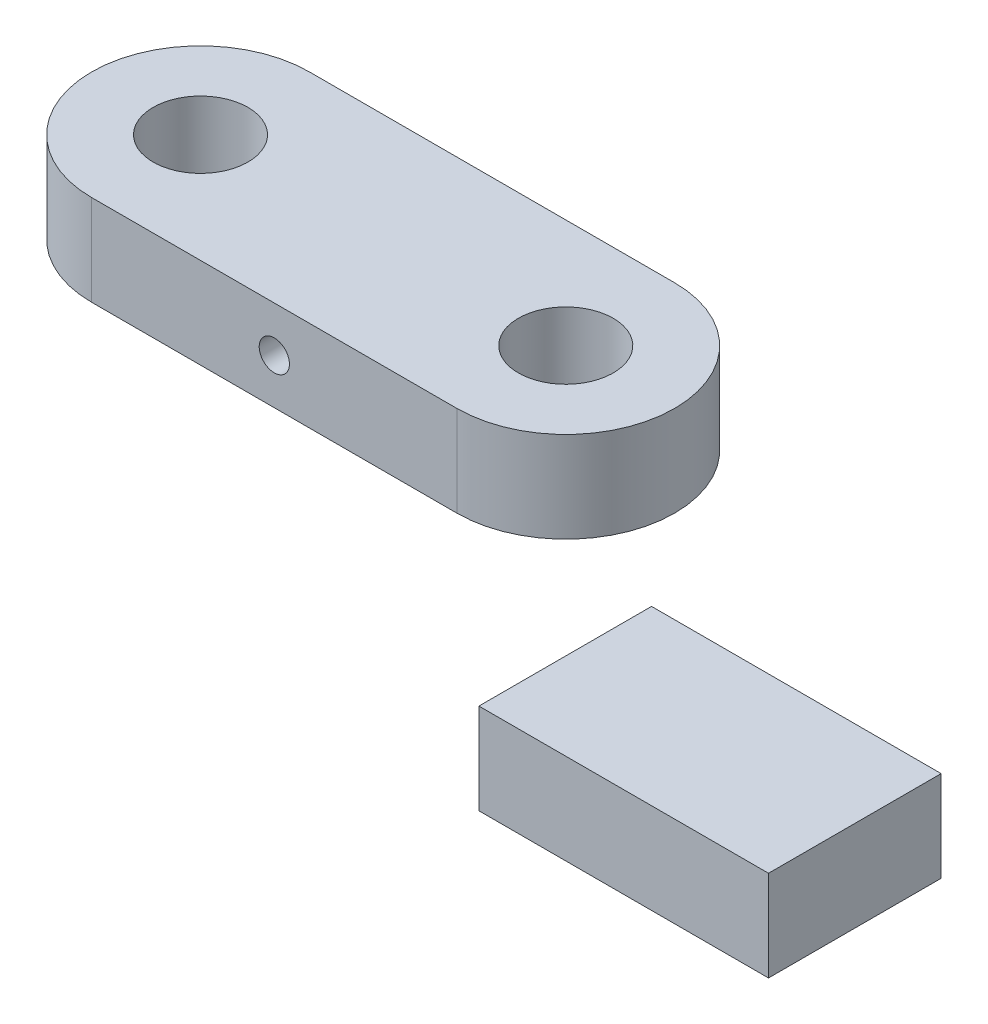
ISO-10303-21;
HEADER;
FILE_DESCRIPTION(('STEP AP214'),'2;1');
FILE_NAME('part.step','',(''),(''),'','','');
FILE_SCHEMA(('AUTOMOTIVE_DESIGN { 1 0 10303 214 1 1 1 1 }'));
ENDSEC;
DATA;
#1=APPLICATION_CONTEXT('core data for automotive mechanical design processes');
#2=APPLICATION_PROTOCOL_DEFINITION('international standard','automotive_design',2000,#1);
#3=PRODUCT_CONTEXT('',#1,'mechanical');
#4=PRODUCT('Part','Part','',(#3));
#5=PRODUCT_RELATED_PRODUCT_CATEGORY('part','',(#4));
#6=PRODUCT_DEFINITION_FORMATION('','',#4);
#7=PRODUCT_DEFINITION_CONTEXT('part definition',#1,'design');
#8=PRODUCT_DEFINITION('design','',#6,#7);
#9=PRODUCT_DEFINITION_SHAPE('','',#8);
#10=(LENGTH_UNIT() NAMED_UNIT(*) SI_UNIT(.MILLI.,.METRE.));
#11=(NAMED_UNIT(*) PLANE_ANGLE_UNIT() SI_UNIT($,.RADIAN.));
#12=(NAMED_UNIT(*) SI_UNIT($,.STERADIAN.) SOLID_ANGLE_UNIT());
#13=UNCERTAINTY_MEASURE_WITH_UNIT(LENGTH_MEASURE(1.E-05),#10,'distance_accuracy_value','');
#14=(GEOMETRIC_REPRESENTATION_CONTEXT(3) GLOBAL_UNCERTAINTY_ASSIGNED_CONTEXT((#13)) GLOBAL_UNIT_ASSIGNED_CONTEXT((#10,
#11,#12)) REPRESENTATION_CONTEXT('',''));
#15=CARTESIAN_POINT('',(0.,0.,0.));
#16=DIRECTION('',(0.,0.,1.));
#17=DIRECTION('',(1.,0.,0.));
#18=AXIS2_PLACEMENT_3D('',#15,#16,#17);
#19=CARTESIAN_POINT('',(0.,4.7625,0.));
#20=DIRECTION('',(0.,1.,0.));
#21=DIRECTION('',(0.,0.,1.));
#22=AXIS2_PLACEMENT_3D('',#19,#20,#21);
#23=PLANE('',#22);
#24=DIRECTION('',(0.,0.,-1.));
#25=VECTOR('',#24,1.);
#26=CARTESIAN_POINT('',(33.2853368756938,4.7625,18.6695257850644));
#27=LINE('',#26,#25);
#28=CARTESIAN_POINT('',(33.2853368756938,4.7625,18.6695257850644));
#29=VERTEX_POINT('',#28);
#30=CARTESIAN_POINT('',(33.2853368756938,4.7625,9.60613363255192));
#31=VERTEX_POINT('',#30);
#32=EDGE_CURVE('E53',#29,#31,#27,.T.);
#33=ORIENTED_EDGE('',*,*,#32,.F.);
#34=DIRECTION('',(-1.,0.,0.));
#35=VECTOR('',#34,1.);
#36=CARTESIAN_POINT('',(33.2853368756938,4.7625,18.6695257850644));
#37=LINE('',#36,#35);
#38=CARTESIAN_POINT('',(48.4896190405113,4.7625,18.6695257850644));
#39=VERTEX_POINT('',#38);
#40=EDGE_CURVE('E76',#39,#29,#37,.T.);
#41=ORIENTED_EDGE('',*,*,#40,.F.);
#42=DIRECTION('',(0.,0.,1.));
#43=VECTOR('',#42,1.);
#44=CARTESIAN_POINT('',(48.4896190405113,4.7625,18.6695257850644));
#45=LINE('',#44,#43);
#46=CARTESIAN_POINT('',(48.4896190405113,4.76250000000001,9.60613363255192));
#47=VERTEX_POINT('',#46);
#48=EDGE_CURVE('E81',#47,#39,#45,.T.);
#49=ORIENTED_EDGE('',*,*,#48,.F.);
#50=DIRECTION('',(1.,0.,0.));
#51=VECTOR('',#50,1.);
#52=CARTESIAN_POINT('',(33.2853368756938,4.7625,9.60613363255192));
#53=LINE('',#52,#51);
#54=EDGE_CURVE('E96',#31,#47,#53,.T.);
#55=ORIENTED_EDGE('',*,*,#54,.F.);
#56=EDGE_LOOP('',(#33,#41,#49,#55));
#57=FACE_BOUND('',#56,.T.);
#58=ADVANCED_FACE('F45',(#57),#23,.T.);
#59=CARTESIAN_POINT('',(0.,0.,0.));
#60=DIRECTION('',(0.,-1.,0.));
#61=DIRECTION('',(0.,0.,-1.));
#62=AXIS2_PLACEMENT_3D('',#59,#60,#61);
#63=PLANE('',#62);
#64=DIRECTION('',(0.,0.,-1.));
#65=VECTOR('',#64,1.);
#66=CARTESIAN_POINT('',(33.2853368756938,0.,18.6695257850644));
#67=LINE('',#66,#65);
#68=CARTESIAN_POINT('',(33.2853368756938,0.,18.6695257850644));
#69=VERTEX_POINT('',#68);
#70=CARTESIAN_POINT('',(33.2853368756938,0.,9.60613363255192));
#71=VERTEX_POINT('',#70);
#72=EDGE_CURVE('E105',#69,#71,#67,.T.);
#73=ORIENTED_EDGE('',*,*,#72,.T.);
#74=DIRECTION('',(1.,0.,0.));
#75=VECTOR('',#74,1.);
#76=CARTESIAN_POINT('',(33.2853368756938,0.,9.60613363255192));
#77=LINE('',#76,#75);
#78=CARTESIAN_POINT('',(48.4896190405113,0.,9.60613363255192));
#79=VERTEX_POINT('',#78);
#80=EDGE_CURVE('E94',#71,#79,#77,.T.);
#81=ORIENTED_EDGE('',*,*,#80,.T.);
#82=DIRECTION('',(0.,0.,1.));
#83=VECTOR('',#82,1.);
#84=CARTESIAN_POINT('',(48.4896190405113,0.,18.6695257850644));
#85=LINE('',#84,#83);
#86=CARTESIAN_POINT('',(48.4896190405113,0.,18.6695257850644));
#87=VERTEX_POINT('',#86);
#88=EDGE_CURVE('E97',#79,#87,#85,.T.);
#89=ORIENTED_EDGE('',*,*,#88,.T.);
#90=DIRECTION('',(-1.,0.,0.));
#91=VECTOR('',#90,1.);
#92=CARTESIAN_POINT('',(33.2853368756938,0.,18.6695257850644));
#93=LINE('',#92,#91);
#94=EDGE_CURVE('E102',#87,#69,#93,.T.);
#95=ORIENTED_EDGE('',*,*,#94,.T.);
#96=EDGE_LOOP('',(#73,#81,#89,#95));
#97=FACE_BOUND('',#96,.T.);
#98=ADVANCED_FACE('F104',(#97),#63,.T.);
#99=CARTESIAN_POINT('',(33.2853368756938,22.4632139250826,9.60613363255192));
#100=DIRECTION('',(0.,0.,-1.));
#101=DIRECTION('',(-1.,0.,0.));
#102=AXIS2_PLACEMENT_3D('',#99,#100,#101);
#103=PLANE('',#102);
#104=DIRECTION('',(0.,-1.,0.));
#105=VECTOR('',#104,1.);
#106=CARTESIAN_POINT('',(33.2853368756938,22.4632139250826,9.60613363255192));
#107=LINE('',#106,#105);
#108=EDGE_CURVE('E12',#31,#71,#107,.T.);
#109=ORIENTED_EDGE('',*,*,#108,.F.);
#110=ORIENTED_EDGE('',*,*,#54,.T.);
#111=DIRECTION('',(0.,-1.,0.));
#112=VECTOR('',#111,1.);
#113=CARTESIAN_POINT('',(48.4896190405113,22.4632139250826,9.60613363255192));
#114=LINE('',#113,#112);
#115=EDGE_CURVE('E91',#47,#79,#114,.T.);
#116=ORIENTED_EDGE('',*,*,#115,.T.);
#117=ORIENTED_EDGE('',*,*,#80,.F.);
#118=EDGE_LOOP('',(#109,#110,#116,#117));
#119=FACE_BOUND('',#118,.T.);
#120=ADVANCED_FACE('F92',(#119),#103,.T.);
#121=CARTESIAN_POINT('',(48.4896190405113,22.4632139250826,18.6695257850644));
#122=DIRECTION('',(1.,0.,0.));
#123=DIRECTION('',(0.,0.,-1.));
#124=AXIS2_PLACEMENT_3D('',#121,#122,#123);
#125=PLANE('',#124);
#126=ORIENTED_EDGE('',*,*,#115,.F.);
#127=ORIENTED_EDGE('',*,*,#48,.T.);
#128=DIRECTION('',(0.,-1.,0.));
#129=VECTOR('',#128,1.);
#130=CARTESIAN_POINT('',(48.4896190405113,22.4632139250826,18.6695257850644));
#131=LINE('',#130,#129);
#132=EDGE_CURVE('E86',#39,#87,#131,.T.);
#133=ORIENTED_EDGE('',*,*,#132,.T.);
#134=ORIENTED_EDGE('',*,*,#88,.F.);
#135=EDGE_LOOP('',(#126,#127,#133,#134));
#136=FACE_BOUND('',#135,.T.);
#137=ADVANCED_FACE('F98',(#136),#125,.T.);
#138=CARTESIAN_POINT('',(33.2853368756938,22.4632139250826,18.6695257850644));
#139=DIRECTION('',(0.,0.,1.));
#140=DIRECTION('',(1.,0.,0.));
#141=AXIS2_PLACEMENT_3D('',#138,#139,#140);
#142=PLANE('',#141);
#143=ORIENTED_EDGE('',*,*,#132,.F.);
#144=ORIENTED_EDGE('',*,*,#40,.T.);
#145=DIRECTION('',(0.,-1.,0.));
#146=VECTOR('',#145,1.);
#147=CARTESIAN_POINT('',(33.2853368756938,22.4632139250826,18.6695257850644));
#148=LINE('',#147,#146);
#149=EDGE_CURVE('E112',#29,#69,#148,.T.);
#150=ORIENTED_EDGE('',*,*,#149,.T.);
#151=ORIENTED_EDGE('',*,*,#94,.F.);
#152=EDGE_LOOP('',(#143,#144,#150,#151));
#153=FACE_BOUND('',#152,.T.);
#154=ADVANCED_FACE('F118',(#153),#142,.T.);
#155=CARTESIAN_POINT('',(33.2853368756938,22.4632139250826,18.6695257850644));
#156=DIRECTION('',(-1.,0.,0.));
#157=DIRECTION('',(0.,0.,1.));
#158=AXIS2_PLACEMENT_3D('',#155,#156,#157);
#159=PLANE('',#158);
#160=ORIENTED_EDGE('',*,*,#149,.F.);
#161=ORIENTED_EDGE('',*,*,#32,.T.);
#162=ORIENTED_EDGE('',*,*,#108,.T.);
#163=ORIENTED_EDGE('',*,*,#72,.F.);
#164=EDGE_LOOP('',(#160,#161,#162,#163));
#165=FACE_BOUND('',#164,.T.);
#166=ADVANCED_FACE('F119',(#165),#159,.T.);
#167=CLOSED_SHELL('',(#58,#98,#120,#137,#154,#166));
#168=MANIFOLD_SOLID_BREP('B2',#167);
#169=CARTESIAN_POINT('',(0.,4.7625,0.));
#170=DIRECTION('',(0.,1.,0.));
#171=DIRECTION('',(0.,0.,1.));
#172=AXIS2_PLACEMENT_3D('',#169,#170,#171);
#173=PLANE('',#172);
#174=CARTESIAN_POINT('',(0.,4.7625,0.));
#175=DIRECTION('',(0.,1.,0.));
#176=DIRECTION('',(0.,0.,1.));
#177=AXIS2_PLACEMENT_3D('',#174,#175,#176);
#178=CIRCLE('',#177,2.4892);
#179=CARTESIAN_POINT('',(0.,4.7625,-2.4892));
#180=VERTEX_POINT('',#179);
#181=EDGE_CURVE('E235',#180,#180,#178,.T.);
#182=ORIENTED_EDGE('',*,*,#181,.F.);
#183=EDGE_LOOP('',(#182));
#184=FACE_BOUND('',#183,.T.);
#185=CARTESIAN_POINT('',(0.,4.7625,0.));
#186=DIRECTION('',(0.,1.,0.));
#187=DIRECTION('',(0.,0.,1.));
#188=AXIS2_PLACEMENT_3D('',#185,#186,#187);
#189=CIRCLE('',#188,5.715);
#190=CARTESIAN_POINT('',(0.,4.7625,-5.715));
#191=VERTEX_POINT('',#190);
#192=CARTESIAN_POINT('',(0.,4.7625,5.715));
#193=VERTEX_POINT('',#192);
#194=EDGE_CURVE('E220',#191,#193,#189,.T.);
#195=ORIENTED_EDGE('',*,*,#194,.T.);
#196=DIRECTION('',(1.,0.,0.));
#197=VECTOR('',#196,1.);
#198=CARTESIAN_POINT('',(0.,4.7625,5.715));
#199=LINE('',#198,#197);
#200=CARTESIAN_POINT('',(19.177,4.7625,5.715));
#201=VERTEX_POINT('',#200);
#202=EDGE_CURVE('E215',#193,#201,#199,.T.);
#203=ORIENTED_EDGE('',*,*,#202,.T.);
#204=CARTESIAN_POINT('',(19.177,4.7625,0.));
#205=DIRECTION('',(0.,1.,0.));
#206=DIRECTION('',(0.,0.,1.));
#207=AXIS2_PLACEMENT_3D('',#204,#205,#206);
#208=CIRCLE('',#207,5.715);
#209=CARTESIAN_POINT('',(19.177,4.7625,-5.715));
#210=VERTEX_POINT('',#209);
#211=EDGE_CURVE('E218',#201,#210,#208,.T.);
#212=ORIENTED_EDGE('',*,*,#211,.T.);
#213=DIRECTION('',(-1.,0.,0.));
#214=VECTOR('',#213,1.);
#215=CARTESIAN_POINT('',(0.,4.7625,-5.715));
#216=LINE('',#215,#214);
#217=EDGE_CURVE('E185',#210,#191,#216,.T.);
#218=ORIENTED_EDGE('',*,*,#217,.T.);
#219=EDGE_LOOP('',(#195,#203,#212,#218));
#220=FACE_BOUND('',#219,.T.);
#221=CARTESIAN_POINT('',(19.177,4.7625,0.));
#222=DIRECTION('',(0.,1.,0.));
#223=DIRECTION('',(0.,0.,1.));
#224=AXIS2_PLACEMENT_3D('',#221,#222,#223);
#225=CIRCLE('',#224,2.4892);
#226=CARTESIAN_POINT('',(19.177,4.7625,-2.4892));
#227=VERTEX_POINT('',#226);
#228=EDGE_CURVE('E250',#227,#227,#225,.T.);
#229=ORIENTED_EDGE('',*,*,#228,.F.);
#230=EDGE_LOOP('',(#229));
#231=FACE_BOUND('',#230,.T.);
#232=ADVANCED_FACE('F168',(#184,#220,#231),#173,.T.);
#233=CARTESIAN_POINT('',(0.,0.,0.));
#234=DIRECTION('',(0.,1.,0.));
#235=DIRECTION('',(0.,0.,1.));
#236=AXIS2_PLACEMENT_3D('',#233,#234,#235);
#237=PLANE('',#236);
#238=CARTESIAN_POINT('',(0.,0.,0.));
#239=DIRECTION('',(0.,1.,0.));
#240=DIRECTION('',(0.,0.,1.));
#241=AXIS2_PLACEMENT_3D('',#238,#239,#240);
#242=CIRCLE('',#241,5.715);
#243=CARTESIAN_POINT('',(0.,0.,-5.715));
#244=VERTEX_POINT('',#243);
#245=CARTESIAN_POINT('',(0.,0.,5.715));
#246=VERTEX_POINT('',#245);
#247=EDGE_CURVE('E232',#244,#246,#242,.T.);
#248=ORIENTED_EDGE('',*,*,#247,.F.);
#249=DIRECTION('',(-1.,0.,0.));
#250=VECTOR('',#249,1.);
#251=CARTESIAN_POINT('',(0.,0.,-5.715));
#252=LINE('',#251,#250);
#253=CARTESIAN_POINT('',(19.177,0.,-5.715));
#254=VERTEX_POINT('',#253);
#255=EDGE_CURVE('E208',#254,#244,#252,.T.);
#256=ORIENTED_EDGE('',*,*,#255,.F.);
#257=CARTESIAN_POINT('',(19.177,0.,0.));
#258=DIRECTION('',(0.,1.,0.));
#259=DIRECTION('',(0.,0.,1.));
#260=AXIS2_PLACEMENT_3D('',#257,#258,#259);
#261=CIRCLE('',#260,5.715);
#262=CARTESIAN_POINT('',(19.177,0.,5.715));
#263=VERTEX_POINT('',#262);
#264=EDGE_CURVE('E202',#263,#254,#261,.T.);
#265=ORIENTED_EDGE('',*,*,#264,.F.);
#266=DIRECTION('',(1.,0.,0.));
#267=VECTOR('',#266,1.);
#268=CARTESIAN_POINT('',(0.,0.,5.715));
#269=LINE('',#268,#267);
#270=EDGE_CURVE('E224',#246,#263,#269,.T.);
#271=ORIENTED_EDGE('',*,*,#270,.F.);
#272=EDGE_LOOP('',(#248,#256,#265,#271));
#273=FACE_BOUND('',#272,.T.);
#274=CARTESIAN_POINT('',(0.,0.,0.));
#275=DIRECTION('',(0.,1.,0.));
#276=DIRECTION('',(0.,0.,1.));
#277=AXIS2_PLACEMENT_3D('',#274,#275,#276);
#278=CIRCLE('',#277,2.4892);
#279=CARTESIAN_POINT('',(0.,0.,-2.4892));
#280=VERTEX_POINT('',#279);
#281=EDGE_CURVE('E247',#280,#280,#278,.T.);
#282=ORIENTED_EDGE('',*,*,#281,.T.);
#283=EDGE_LOOP('',(#282));
#284=FACE_BOUND('',#283,.T.);
#285=CARTESIAN_POINT('',(19.177,0.,0.));
#286=DIRECTION('',(0.,1.,0.));
#287=DIRECTION('',(0.,0.,1.));
#288=AXIS2_PLACEMENT_3D('',#285,#286,#287);
#289=CIRCLE('',#288,2.4892);
#290=CARTESIAN_POINT('',(19.177,0.,-2.4892));
#291=VERTEX_POINT('',#290);
#292=EDGE_CURVE('E253',#291,#291,#289,.T.);
#293=ORIENTED_EDGE('',*,*,#292,.T.);
#294=EDGE_LOOP('',(#293));
#295=FACE_BOUND('',#294,.T.);
#296=ADVANCED_FACE('F243',(#273,#284,#295),#237,.F.);
#297=CARTESIAN_POINT('',(0.,4.7625,0.));
#298=DIRECTION('',(0.,-1.,0.));
#299=DIRECTION('',(0.,0.,-1.));
#300=AXIS2_PLACEMENT_3D('',#297,#298,#299);
#301=CYLINDRICAL_SURFACE('',#300,5.715);
#302=ORIENTED_EDGE('',*,*,#247,.T.);
#303=DIRECTION('',(0.,-1.,0.));
#304=VECTOR('',#303,1.);
#305=CARTESIAN_POINT('',(0.,4.7625,5.715));
#306=LINE('',#305,#304);
#307=EDGE_CURVE('E43',#193,#246,#306,.T.);
#308=ORIENTED_EDGE('',*,*,#307,.F.);
#309=ORIENTED_EDGE('',*,*,#194,.F.);
#310=DIRECTION('',(0.,-1.,0.));
#311=VECTOR('',#310,1.);
#312=CARTESIAN_POINT('',(0.,4.7625,-5.715));
#313=LINE('',#312,#311);
#314=EDGE_CURVE('E228',#191,#244,#313,.T.);
#315=ORIENTED_EDGE('',*,*,#314,.T.);
#316=EDGE_LOOP('',(#302,#308,#309,#315));
#317=FACE_BOUND('',#316,.T.);
#318=ADVANCED_FACE('F170',(#317),#301,.T.);
#319=CARTESIAN_POINT('',(0.,4.7625,5.715));
#320=DIRECTION('',(0.,0.,-1.));
#321=DIRECTION('',(-1.,0.,0.));
#322=AXIS2_PLACEMENT_3D('',#319,#320,#321);
#323=PLANE('',#322);
#324=CARTESIAN_POINT('',(9.5885,2.38125,5.715));
#325=DIRECTION('',(0.,0.,-1.));
#326=DIRECTION('',(-1.,0.,0.));
#327=AXIS2_PLACEMENT_3D('',#324,#325,#326);
#328=CIRCLE('',#327,0.793749999999999);
#329=CARTESIAN_POINT('',(8.79475,2.38125,5.715));
#330=VERTEX_POINT('',#329);
#331=EDGE_CURVE('E256',#330,#330,#328,.T.);
#332=ORIENTED_EDGE('',*,*,#331,.T.);
#333=EDGE_LOOP('',(#332));
#334=FACE_BOUND('',#333,.T.);
#335=ORIENTED_EDGE('',*,*,#270,.T.);
#336=DIRECTION('',(0.,-1.,0.));
#337=VECTOR('',#336,1.);
#338=CARTESIAN_POINT('',(19.177,4.7625,5.715));
#339=LINE('',#338,#337);
#340=EDGE_CURVE('E177',#201,#263,#339,.T.);
#341=ORIENTED_EDGE('',*,*,#340,.F.);
#342=ORIENTED_EDGE('',*,*,#202,.F.);
#343=ORIENTED_EDGE('',*,*,#307,.T.);
#344=EDGE_LOOP('',(#335,#341,#342,#343));
#345=FACE_BOUND('',#344,.T.);
#346=ADVANCED_FACE('F223',(#334,#345),#323,.F.);
#347=CARTESIAN_POINT('',(19.177,4.7625,0.));
#348=DIRECTION('',(0.,-1.,0.));
#349=DIRECTION('',(0.,0.,-1.));
#350=AXIS2_PLACEMENT_3D('',#347,#348,#349);
#351=CYLINDRICAL_SURFACE('',#350,5.715);
#352=ORIENTED_EDGE('',*,*,#264,.T.);
#353=DIRECTION('',(0.,-1.,0.));
#354=VECTOR('',#353,1.);
#355=CARTESIAN_POINT('',(19.177,4.7625,-5.715));
#356=LINE('',#355,#354);
#357=EDGE_CURVE('E225',#210,#254,#356,.T.);
#358=ORIENTED_EDGE('',*,*,#357,.F.);
#359=ORIENTED_EDGE('',*,*,#211,.F.);
#360=ORIENTED_EDGE('',*,*,#340,.T.);
#361=EDGE_LOOP('',(#352,#358,#359,#360));
#362=FACE_BOUND('',#361,.T.);
#363=ADVANCED_FACE('F226',(#362),#351,.T.);
#364=CARTESIAN_POINT('',(0.,4.7625,-5.715));
#365=DIRECTION('',(0.,0.,1.));
#366=DIRECTION('',(1.,0.,0.));
#367=AXIS2_PLACEMENT_3D('',#364,#365,#366);
#368=PLANE('',#367);
#369=CARTESIAN_POINT('',(9.5885,2.38125,-5.715));
#370=DIRECTION('',(0.,0.,1.));
#371=DIRECTION('',(1.,0.,0.));
#372=AXIS2_PLACEMENT_3D('',#369,#370,#371);
#373=CIRCLE('',#372,0.793749999999999);
#374=CARTESIAN_POINT('',(10.38225,2.38125,-5.715));
#375=VERTEX_POINT('',#374);
#376=EDGE_CURVE('E261',#375,#375,#373,.T.);
#377=ORIENTED_EDGE('',*,*,#376,.T.);
#378=EDGE_LOOP('',(#377));
#379=FACE_BOUND('',#378,.T.);
#380=ORIENTED_EDGE('',*,*,#255,.T.);
#381=ORIENTED_EDGE('',*,*,#314,.F.);
#382=ORIENTED_EDGE('',*,*,#217,.F.);
#383=ORIENTED_EDGE('',*,*,#357,.T.);
#384=EDGE_LOOP('',(#380,#381,#382,#383));
#385=FACE_BOUND('',#384,.T.);
#386=ADVANCED_FACE('F240',(#379,#385),#368,.F.);
#387=CARTESIAN_POINT('',(0.,4.7625,0.));
#388=DIRECTION('',(0.,-1.,0.));
#389=DIRECTION('',(0.,0.,-1.));
#390=AXIS2_PLACEMENT_3D('',#387,#388,#389);
#391=CYLINDRICAL_SURFACE('',#390,2.4892);
#392=CARTESIAN_POINT('',(0.,4.7625,-2.4892));
#393=CARTESIAN_POINT('',(0.,4.712890625,-2.4892));
#394=CARTESIAN_POINT('',(0.,4.66328125,-2.4892));
#395=CARTESIAN_POINT('',(0.,4.5640625,-2.4892));
#396=CARTESIAN_POINT('',(0.,4.514453125,-2.4892));
#397=CARTESIAN_POINT('',(0.,4.415234375,-2.4892));
#398=CARTESIAN_POINT('',(0.,4.365625,-2.4892));
#399=CARTESIAN_POINT('',(0.,4.26640625,-2.4892));
#400=CARTESIAN_POINT('',(0.,4.216796875,-2.4892));
#401=CARTESIAN_POINT('',(0.,4.117578125,-2.4892));
#402=CARTESIAN_POINT('',(0.,4.06796875,-2.4892));
#403=CARTESIAN_POINT('',(0.,3.96875,-2.4892));
#404=CARTESIAN_POINT('',(0.,3.919140625,-2.4892));
#405=CARTESIAN_POINT('',(0.,3.819921875,-2.4892));
#406=CARTESIAN_POINT('',(0.,3.7703125,-2.4892));
#407=CARTESIAN_POINT('',(0.,3.67109375,-2.4892));
#408=CARTESIAN_POINT('',(0.,3.621484375,-2.4892));
#409=CARTESIAN_POINT('',(0.,3.522265625,-2.4892));
#410=CARTESIAN_POINT('',(0.,3.47265625,-2.4892));
#411=CARTESIAN_POINT('',(0.,3.3734375,-2.4892));
#412=CARTESIAN_POINT('',(0.,3.323828125,-2.4892));
#413=CARTESIAN_POINT('',(0.,3.224609375,-2.4892));
#414=CARTESIAN_POINT('',(0.,3.175,-2.4892));
#415=CARTESIAN_POINT('',(0.,3.07578125,-2.4892));
#416=CARTESIAN_POINT('',(0.,3.026171875,-2.4892));
#417=CARTESIAN_POINT('',(0.,2.926953125,-2.4892));
#418=CARTESIAN_POINT('',(0.,2.87734375,-2.4892));
#419=CARTESIAN_POINT('',(0.,2.778125,-2.4892));
#420=CARTESIAN_POINT('',(0.,2.728515625,-2.4892));
#421=CARTESIAN_POINT('',(0.,2.629296875,-2.4892));
#422=CARTESIAN_POINT('',(0.,2.5796875,-2.4892));
#423=CARTESIAN_POINT('',(0.,2.48046875,-2.4892));
#424=CARTESIAN_POINT('',(0.,2.430859375,-2.4892));
#425=CARTESIAN_POINT('',(0.,2.331640625,-2.4892));
#426=CARTESIAN_POINT('',(0.,2.28203125,-2.4892));
#427=CARTESIAN_POINT('',(0.,2.1828125,-2.4892));
#428=CARTESIAN_POINT('',(0.,2.133203125,-2.4892));
#429=CARTESIAN_POINT('',(0.,2.033984375,-2.4892));
#430=CARTESIAN_POINT('',(0.,1.984375,-2.4892));
#431=CARTESIAN_POINT('',(0.,1.88515625,-2.4892));
#432=CARTESIAN_POINT('',(0.,1.835546875,-2.4892));
#433=CARTESIAN_POINT('',(0.,1.736328125,-2.4892));
#434=CARTESIAN_POINT('',(0.,1.68671875,-2.4892));
#435=CARTESIAN_POINT('',(0.,1.5875,-2.4892));
#436=CARTESIAN_POINT('',(0.,1.537890625,-2.4892));
#437=CARTESIAN_POINT('',(0.,1.438671875,-2.4892));
#438=CARTESIAN_POINT('',(0.,1.3890625,-2.4892));
#439=CARTESIAN_POINT('',(0.,1.28984375,-2.4892));
#440=CARTESIAN_POINT('',(0.,1.240234375,-2.4892));
#441=CARTESIAN_POINT('',(0.,1.141015625,-2.4892));
#442=CARTESIAN_POINT('',(0.,1.09140625,-2.4892));
#443=CARTESIAN_POINT('',(0.,0.992187499999999,-2.4892));
#444=CARTESIAN_POINT('',(0.,0.942578124999999,-2.4892));
#445=CARTESIAN_POINT('',(0.,0.843359375,-2.4892));
#446=CARTESIAN_POINT('',(0.,0.79375,-2.4892));
#447=CARTESIAN_POINT('',(0.,0.69453125,-2.4892));
#448=CARTESIAN_POINT('',(0.,0.644921875,-2.4892));
#449=CARTESIAN_POINT('',(0.,0.545703125,-2.4892));
#450=CARTESIAN_POINT('',(0.,0.49609375,-2.4892));
#451=CARTESIAN_POINT('',(0.,0.396875,-2.4892));
#452=CARTESIAN_POINT('',(0.,0.347265625,-2.4892));
#453=CARTESIAN_POINT('',(0.,0.248046875,-2.4892));
#454=CARTESIAN_POINT('',(0.,0.1984375,-2.4892));
#455=CARTESIAN_POINT('',(0.,0.09921875,-2.4892));
#456=CARTESIAN_POINT('',(0.,0.049609375,-2.4892));
#457=CARTESIAN_POINT('',(0.,0.,-2.4892));
#458=B_SPLINE_CURVE_WITH_KNOTS('',3,(#392,#393,#394,#395,#396,#397,#398,#399,#400,#401,#402,
#403,#404,#405,#406,#407,#408,#409,#410,#411,#412,#413,#414,#415,#416,#417,#418,#419,#420,#421,
#422,#423,#424,#425,#426,#427,#428,#429,#430,#431,#432,#433,#434,#435,#436,#437,#438,#439,#440,
#441,#442,#443,#444,#445,#446,#447,#448,#449,#450,#451,#452,#453,#454,#455,#456,#457),
.UNSPECIFIED.,.F.,.F.,(4,2,2,2,2,2,2,2,2,2,2,2,2,2,2,2,2,2,2,2,2,2,2,2,2,2,2,2,2,2,2,2,4),(0.,
0.148828125,0.29765625,0.446484375,0.5953125,0.744140625,0.892968750000001,1.041796875,1.190625,
1.339453125,1.48828125,1.637109375,1.7859375,1.934765625,2.08359375,2.232421875,2.38125,
2.530078125,2.67890625,2.827734375,2.9765625,3.125390625,3.27421875,3.423046875,3.571875,
3.720703125,3.86953125,4.018359375,4.1671875,4.316015625,4.46484375,4.613671875,4.7625),.UNSPECIFIED.);
#459=EDGE_CURVE('BSEAM288',#180,#280,#458,.T.);
#460=ORIENTED_EDGE('',*,*,#181,.T.);
#461=ORIENTED_EDGE('',*,*,#281,.F.);
#462=ORIENTED_EDGE('',*,*,#459,.T.);
#463=ORIENTED_EDGE('',*,*,#459,.F.);
#464=EDGE_LOOP('',(#460,#462,#461,#463));
#465=FACE_BOUND('',#464,.T.);
#466=ADVANCED_FACE('F288',(#465),#391,.F.);
#467=CARTESIAN_POINT('',(19.177,4.7625,0.));
#468=DIRECTION('',(0.,-1.,0.));
#469=DIRECTION('',(0.,0.,-1.));
#470=AXIS2_PLACEMENT_3D('',#467,#468,#469);
#471=CYLINDRICAL_SURFACE('',#470,2.4892);
#472=CARTESIAN_POINT('',(19.177,4.7625,-2.4892));
#473=CARTESIAN_POINT('',(19.177,4.712890625,-2.4892));
#474=CARTESIAN_POINT('',(19.177,4.66328125,-2.4892));
#475=CARTESIAN_POINT('',(19.177,4.5640625,-2.4892));
#476=CARTESIAN_POINT('',(19.177,4.514453125,-2.4892));
#477=CARTESIAN_POINT('',(19.177,4.415234375,-2.4892));
#478=CARTESIAN_POINT('',(19.177,4.365625,-2.4892));
#479=CARTESIAN_POINT('',(19.177,4.26640625,-2.4892));
#480=CARTESIAN_POINT('',(19.177,4.216796875,-2.4892));
#481=CARTESIAN_POINT('',(19.177,4.117578125,-2.4892));
#482=CARTESIAN_POINT('',(19.177,4.06796875,-2.4892));
#483=CARTESIAN_POINT('',(19.177,3.96875,-2.4892));
#484=CARTESIAN_POINT('',(19.177,3.919140625,-2.4892));
#485=CARTESIAN_POINT('',(19.177,3.819921875,-2.4892));
#486=CARTESIAN_POINT('',(19.177,3.7703125,-2.4892));
#487=CARTESIAN_POINT('',(19.177,3.67109375,-2.4892));
#488=CARTESIAN_POINT('',(19.177,3.621484375,-2.4892));
#489=CARTESIAN_POINT('',(19.177,3.522265625,-2.4892));
#490=CARTESIAN_POINT('',(19.177,3.47265625,-2.4892));
#491=CARTESIAN_POINT('',(19.177,3.3734375,-2.4892));
#492=CARTESIAN_POINT('',(19.177,3.323828125,-2.4892));
#493=CARTESIAN_POINT('',(19.177,3.224609375,-2.4892));
#494=CARTESIAN_POINT('',(19.177,3.175,-2.4892));
#495=CARTESIAN_POINT('',(19.177,3.07578125,-2.4892));
#496=CARTESIAN_POINT('',(19.177,3.026171875,-2.4892));
#497=CARTESIAN_POINT('',(19.177,2.926953125,-2.4892));
#498=CARTESIAN_POINT('',(19.177,2.87734375,-2.4892));
#499=CARTESIAN_POINT('',(19.177,2.778125,-2.4892));
#500=CARTESIAN_POINT('',(19.177,2.728515625,-2.4892));
#501=CARTESIAN_POINT('',(19.177,2.629296875,-2.4892));
#502=CARTESIAN_POINT('',(19.177,2.5796875,-2.4892));
#503=CARTESIAN_POINT('',(19.177,2.48046875,-2.4892));
#504=CARTESIAN_POINT('',(19.177,2.430859375,-2.4892));
#505=CARTESIAN_POINT('',(19.177,2.331640625,-2.4892));
#506=CARTESIAN_POINT('',(19.177,2.28203125,-2.4892));
#507=CARTESIAN_POINT('',(19.177,2.1828125,-2.4892));
#508=CARTESIAN_POINT('',(19.177,2.133203125,-2.4892));
#509=CARTESIAN_POINT('',(19.177,2.033984375,-2.4892));
#510=CARTESIAN_POINT('',(19.177,1.984375,-2.4892));
#511=CARTESIAN_POINT('',(19.177,1.88515625,-2.4892));
#512=CARTESIAN_POINT('',(19.177,1.835546875,-2.4892));
#513=CARTESIAN_POINT('',(19.177,1.736328125,-2.4892));
#514=CARTESIAN_POINT('',(19.177,1.68671875,-2.4892));
#515=CARTESIAN_POINT('',(19.177,1.5875,-2.4892));
#516=CARTESIAN_POINT('',(19.177,1.537890625,-2.4892));
#517=CARTESIAN_POINT('',(19.177,1.438671875,-2.4892));
#518=CARTESIAN_POINT('',(19.177,1.3890625,-2.4892));
#519=CARTESIAN_POINT('',(19.177,1.28984375,-2.4892));
#520=CARTESIAN_POINT('',(19.177,1.240234375,-2.4892));
#521=CARTESIAN_POINT('',(19.177,1.141015625,-2.4892));
#522=CARTESIAN_POINT('',(19.177,1.09140625,-2.4892));
#523=CARTESIAN_POINT('',(19.177,0.992187499999999,-2.4892));
#524=CARTESIAN_POINT('',(19.177,0.942578124999999,-2.4892));
#525=CARTESIAN_POINT('',(19.177,0.843359375,-2.4892));
#526=CARTESIAN_POINT('',(19.177,0.79375,-2.4892));
#527=CARTESIAN_POINT('',(19.177,0.69453125,-2.4892));
#528=CARTESIAN_POINT('',(19.177,0.644921875,-2.4892));
#529=CARTESIAN_POINT('',(19.177,0.545703125,-2.4892));
#530=CARTESIAN_POINT('',(19.177,0.49609375,-2.4892));
#531=CARTESIAN_POINT('',(19.177,0.396875,-2.4892));
#532=CARTESIAN_POINT('',(19.177,0.347265625,-2.4892));
#533=CARTESIAN_POINT('',(19.177,0.248046875,-2.4892));
#534=CARTESIAN_POINT('',(19.177,0.1984375,-2.4892));
#535=CARTESIAN_POINT('',(19.177,0.09921875,-2.4892));
#536=CARTESIAN_POINT('',(19.177,0.049609375,-2.4892));
#537=CARTESIAN_POINT('',(19.177,0.,-2.4892));
#538=B_SPLINE_CURVE_WITH_KNOTS('',3,(#472,#473,#474,#475,#476,#477,#478,#479,#480,#481,#482,
#483,#484,#485,#486,#487,#488,#489,#490,#491,#492,#493,#494,#495,#496,#497,#498,#499,#500,#501,
#502,#503,#504,#505,#506,#507,#508,#509,#510,#511,#512,#513,#514,#515,#516,#517,#518,#519,#520,
#521,#522,#523,#524,#525,#526,#527,#528,#529,#530,#531,#532,#533,#534,#535,#536,#537),
.UNSPECIFIED.,.F.,.F.,(4,2,2,2,2,2,2,2,2,2,2,2,2,2,2,2,2,2,2,2,2,2,2,2,2,2,2,2,2,2,2,2,4),(0.,
0.148828125,0.29765625,0.446484375,0.5953125,0.744140625,0.892968750000001,1.041796875,1.190625,
1.339453125,1.48828125,1.637109375,1.7859375,1.934765625,2.08359375,2.232421875,2.38125,
2.530078125,2.67890625,2.827734375,2.9765625,3.125390625,3.27421875,3.423046875,3.571875,
3.720703125,3.86953125,4.018359375,4.1671875,4.316015625,4.46484375,4.613671875,4.7625),.UNSPECIFIED.);
#539=EDGE_CURVE('BSEAM269',#227,#291,#538,.T.);
#540=ORIENTED_EDGE('',*,*,#228,.T.);
#541=ORIENTED_EDGE('',*,*,#292,.F.);
#542=ORIENTED_EDGE('',*,*,#539,.T.);
#543=ORIENTED_EDGE('',*,*,#539,.F.);
#544=EDGE_LOOP('',(#540,#542,#541,#543));
#545=FACE_BOUND('',#544,.T.);
#546=ADVANCED_FACE('F269',(#545),#471,.F.);
#547=CARTESIAN_POINT('',(9.5885,2.38125,-5.715));
#548=DIRECTION('',(0.,0.,1.));
#549=DIRECTION('',(1.,0.,0.));
#550=AXIS2_PLACEMENT_3D('',#547,#548,#549);
#551=CYLINDRICAL_SURFACE('',#550,0.793749999999999);
#552=ORIENTED_EDGE('',*,*,#376,.F.);
#553=EDGE_LOOP('',(#552));
#554=FACE_BOUND('',#553,.T.);
#555=ORIENTED_EDGE('',*,*,#331,.F.);
#556=EDGE_LOOP('',(#555));
#557=FACE_BOUND('',#556,.T.);
#558=ADVANCED_FACE('F266',(#554,#557),#551,.F.);
#559=CLOSED_SHELL('',(#232,#296,#318,#346,#363,#386,#466,#546,#558));
#560=MANIFOLD_SOLID_BREP('B6',#559);
#561=ADVANCED_BREP_SHAPE_REPRESENTATION('',(#18,#168,#560),#14);
#562=SHAPE_DEFINITION_REPRESENTATION(#9,#561);
ENDSEC;
END-ISO-10303-21;
